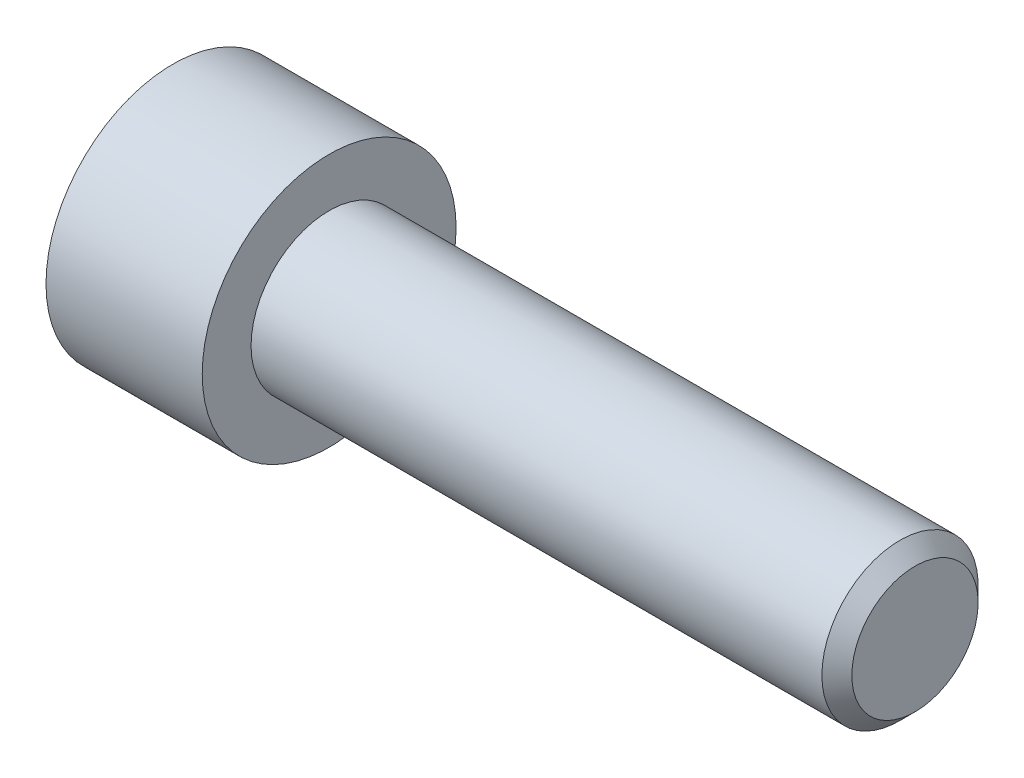
ISO-10303-21;
HEADER;
FILE_DESCRIPTION(('STEP AP214'),'2;1');
FILE_NAME('part.step','',(''),(''),'','','');
FILE_SCHEMA(('AUTOMOTIVE_DESIGN { 1 0 10303 214 1 1 1 1 }'));
ENDSEC;
DATA;
#1=APPLICATION_CONTEXT('core data for automotive mechanical design processes');
#2=APPLICATION_PROTOCOL_DEFINITION('international standard','automotive_design',2000,#1);
#3=PRODUCT_CONTEXT('',#1,'mechanical');
#4=PRODUCT('Part','Part','',(#3));
#5=PRODUCT_RELATED_PRODUCT_CATEGORY('part','',(#4));
#6=PRODUCT_DEFINITION_FORMATION('','',#4);
#7=PRODUCT_DEFINITION_CONTEXT('part definition',#1,'design');
#8=PRODUCT_DEFINITION('design','',#6,#7);
#9=PRODUCT_DEFINITION_SHAPE('','',#8);
#10=(LENGTH_UNIT() NAMED_UNIT(*) SI_UNIT(.MILLI.,.METRE.));
#11=(NAMED_UNIT(*) PLANE_ANGLE_UNIT() SI_UNIT($,.RADIAN.));
#12=(NAMED_UNIT(*) SI_UNIT($,.STERADIAN.) SOLID_ANGLE_UNIT());
#13=UNCERTAINTY_MEASURE_WITH_UNIT(LENGTH_MEASURE(1.E-05),#10,'distance_accuracy_value','');
#14=(GEOMETRIC_REPRESENTATION_CONTEXT(3) GLOBAL_UNCERTAINTY_ASSIGNED_CONTEXT((#13)) GLOBAL_UNIT_ASSIGNED_CONTEXT((#10,
#11,#12)) REPRESENTATION_CONTEXT('',''));
#15=CARTESIAN_POINT('',(0.,0.,0.));
#16=DIRECTION('',(0.,0.,1.));
#17=DIRECTION('',(1.,0.,0.));
#18=AXIS2_PLACEMENT_3D('',#15,#16,#17);
#19=CARTESIAN_POINT('',(-4.0000000000191,0.,0.));
#20=DIRECTION('',(-1.,0.,0.));
#21=DIRECTION('',(0.,0.,1.));
#22=AXIS2_PLACEMENT_3D('',#19,#20,#21);
#23=CONICAL_SURFACE('',#22,2.99000000001115,1.04719755118497);
#24=CARTESIAN_POINT('',(-4.0000000000191,0.,0.));
#25=DIRECTION('',(-1.,0.,0.));
#26=DIRECTION('',(0.,0.,1.));
#27=AXIS2_PLACEMENT_3D('',#24,#25,#26);
#28=CIRCLE('',#27,2.99000000001115);
#29=CARTESIAN_POINT('',(-4.0000000000191,0.,2.99000000001115));
#30=VERTEX_POINT('',#29);
#31=EDGE_CURVE('E19',#30,#30,#28,.T.);
#32=ORIENTED_EDGE('',*,*,#31,.T.);
#33=EDGE_LOOP('',(#32));
#34=FACE_BOUND('',#33,.T.);
#35=CARTESIAN_POINT('',(-2.27372269515058,-5.6843418860808E-11,0.));
#36=VERTEX_POINT('',#35);
#37=VERTEX_LOOP('',#36);
#38=FACE_BOUND('',#37,.T.);
#39=ADVANCED_FACE('F16',(#34,#38),#23,.F.);
#40=CARTESIAN_POINT('',(-4.,0.,0.));
#41=DIRECTION('',(1.,0.,0.));
#42=DIRECTION('',(0.,0.,-1.));
#43=AXIS2_PLACEMENT_3D('',#40,#41,#42);
#44=PLANE('',#43);
#45=ORIENTED_EDGE('',*,*,#31,.F.);
#46=EDGE_LOOP('',(#45));
#47=FACE_BOUND('',#46,.T.);
#48=DIRECTION('',(0.,0.5,0.866025403784439));
#49=VECTOR('',#48,1.);
#50=CARTESIAN_POINT('',(-4.,3.46410161513775,0.));
#51=LINE('',#50,#49);
#52=CARTESIAN_POINT('',(-4.,3.46410161513775,0.));
#53=VERTEX_POINT('',#52);
#54=CARTESIAN_POINT('',(-4.,1.73205080756888,-3.));
#55=VERTEX_POINT('',#54);
#56=EDGE_CURVE('E153',#53,#55,#51,.F.);
#57=ORIENTED_EDGE('',*,*,#56,.T.);
#58=DIRECTION('',(0.,1.,0.));
#59=VECTOR('',#58,1.);
#60=CARTESIAN_POINT('',(-4.,1.73205080756888,-3.));
#61=LINE('',#60,#59);
#62=CARTESIAN_POINT('',(-4.,-1.73205080756888,-3.));
#63=VERTEX_POINT('',#62);
#64=EDGE_CURVE('E162',#55,#63,#61,.F.);
#65=ORIENTED_EDGE('',*,*,#64,.T.);
#66=DIRECTION('',(0.,0.5,-0.866025403784439));
#67=VECTOR('',#66,1.);
#68=CARTESIAN_POINT('',(-4.,-1.73205080756888,-3.));
#69=LINE('',#68,#67);
#70=CARTESIAN_POINT('',(-4.,-3.46410161513775,0.));
#71=VERTEX_POINT('',#70);
#72=EDGE_CURVE('E167',#63,#71,#69,.F.);
#73=ORIENTED_EDGE('',*,*,#72,.T.);
#74=DIRECTION('',(0.,-0.5,-0.866025403784439));
#75=VECTOR('',#74,1.);
#76=CARTESIAN_POINT('',(-4.,-3.46410161513775,0.));
#77=LINE('',#76,#75);
#78=CARTESIAN_POINT('',(-4.,-1.73205080756888,3.));
#79=VERTEX_POINT('',#78);
#80=EDGE_CURVE('E172',#71,#79,#77,.F.);
#81=ORIENTED_EDGE('',*,*,#80,.T.);
#82=DIRECTION('',(0.,1.,0.));
#83=VECTOR('',#82,1.);
#84=CARTESIAN_POINT('',(-4.,-1.73205080756888,3.));
#85=LINE('',#84,#83);
#86=CARTESIAN_POINT('',(-4.,1.73205080756888,3.));
#87=VERTEX_POINT('',#86);
#88=EDGE_CURVE('E139',#79,#87,#85,.T.);
#89=ORIENTED_EDGE('',*,*,#88,.T.);
#90=DIRECTION('',(0.,-0.5,0.866025403784439));
#91=VECTOR('',#90,1.);
#92=CARTESIAN_POINT('',(-4.,1.73205080756888,3.));
#93=LINE('',#92,#91);
#94=EDGE_CURVE('E68',#87,#53,#93,.F.);
#95=ORIENTED_EDGE('',*,*,#94,.T.);
#96=EDGE_LOOP('',(#57,#65,#73,#81,#89,#95));
#97=FACE_BOUND('',#96,.T.);
#98=ADVANCED_FACE('F73',(#47,#97),#44,.F.);
#99=CARTESIAN_POINT('',(-8.,1.73205080756888,3.));
#100=DIRECTION('',(0.,0.866025403784439,0.5));
#101=DIRECTION('',(0.,-0.5,0.866025403784439));
#102=AXIS2_PLACEMENT_3D('',#99,#100,#101);
#103=PLANE('',#102);
#104=DIRECTION('',(1.,0.,0.));
#105=VECTOR('',#104,1.);
#106=CARTESIAN_POINT('',(-8.,1.73205080756888,3.));
#107=LINE('',#106,#105);
#108=CARTESIAN_POINT('',(-8.,1.73205080756888,3.));
#109=VERTEX_POINT('',#108);
#110=EDGE_CURVE('E134',#87,#109,#107,.F.);
#111=ORIENTED_EDGE('',*,*,#110,.T.);
#112=DIRECTION('',(0.,-0.499999999999998,0.86602540378444));
#113=VECTOR('',#112,1.);
#114=CARTESIAN_POINT('',(-8.,3.46410161513775,0.));
#115=LINE('',#114,#113);
#116=CARTESIAN_POINT('',(-8.,3.46410161513775,0.));
#117=VERTEX_POINT('',#116);
#118=EDGE_CURVE('E137',#117,#109,#115,.T.);
#119=ORIENTED_EDGE('',*,*,#118,.F.);
#120=DIRECTION('',(1.,0.,0.));
#121=VECTOR('',#120,1.);
#122=CARTESIAN_POINT('',(-8.,3.46410161513775,0.));
#123=LINE('',#122,#121);
#124=EDGE_CURVE('E156',#117,#53,#123,.T.);
#125=ORIENTED_EDGE('',*,*,#124,.T.);
#126=ORIENTED_EDGE('',*,*,#94,.F.);
#127=EDGE_LOOP('',(#111,#119,#125,#126));
#128=FACE_BOUND('',#127,.T.);
#129=ADVANCED_FACE('F79',(#128),#103,.F.);
#130=CARTESIAN_POINT('',(-8.,-1.73205080756888,3.));
#131=DIRECTION('',(0.,0.,1.));
#132=DIRECTION('',(1.,0.,0.));
#133=AXIS2_PLACEMENT_3D('',#130,#131,#132);
#134=PLANE('',#133);
#135=DIRECTION('',(1.,0.,0.));
#136=VECTOR('',#135,1.);
#137=CARTESIAN_POINT('',(-8.,-1.73205080756887,3.));
#138=LINE('',#137,#136);
#139=CARTESIAN_POINT('',(-8.,-1.73205080756888,3.));
#140=VERTEX_POINT('',#139);
#141=EDGE_CURVE('E144',#79,#140,#138,.F.);
#142=ORIENTED_EDGE('',*,*,#141,.T.);
#143=DIRECTION('',(0.,1.,0.));
#144=VECTOR('',#143,1.);
#145=CARTESIAN_POINT('',(-8.,3.25,3.));
#146=LINE('',#145,#144);
#147=EDGE_CURVE('E142',#109,#140,#146,.F.);
#148=ORIENTED_EDGE('',*,*,#147,.F.);
#149=ORIENTED_EDGE('',*,*,#110,.F.);
#150=ORIENTED_EDGE('',*,*,#88,.F.);
#151=EDGE_LOOP('',(#142,#148,#149,#150));
#152=FACE_BOUND('',#151,.T.);
#153=ADVANCED_FACE('F125',(#152),#134,.F.);
#154=CARTESIAN_POINT('',(-8.,-3.46410161513775,0.));
#155=DIRECTION('',(0.,-0.866025403784439,0.5));
#156=DIRECTION('',(0.,-0.5,-0.866025403784439));
#157=AXIS2_PLACEMENT_3D('',#154,#155,#156);
#158=PLANE('',#157);
#159=DIRECTION('',(1.,0.,0.));
#160=VECTOR('',#159,1.);
#161=CARTESIAN_POINT('',(-8.,-3.46410161513776,0.));
#162=LINE('',#161,#160);
#163=CARTESIAN_POINT('',(-8.,-3.46410161513775,0.));
#164=VERTEX_POINT('',#163);
#165=EDGE_CURVE('E170',#71,#164,#162,.F.);
#166=ORIENTED_EDGE('',*,*,#165,.T.);
#167=DIRECTION('',(0.,-0.499999999999998,-0.86602540378444));
#168=VECTOR('',#167,1.);
#169=CARTESIAN_POINT('',(-8.,-1.73205080756888,3.));
#170=LINE('',#169,#168);
#171=EDGE_CURVE('E147',#140,#164,#170,.T.);
#172=ORIENTED_EDGE('',*,*,#171,.F.);
#173=ORIENTED_EDGE('',*,*,#141,.F.);
#174=ORIENTED_EDGE('',*,*,#80,.F.);
#175=EDGE_LOOP('',(#166,#172,#173,#174));
#176=FACE_BOUND('',#175,.T.);
#177=ADVANCED_FACE('F121',(#176),#158,.F.);
#178=CARTESIAN_POINT('',(-8.,-1.73205080756888,-3.));
#179=DIRECTION('',(0.,-0.866025403784439,-0.5));
#180=DIRECTION('',(0.,0.5,-0.866025403784439));
#181=AXIS2_PLACEMENT_3D('',#178,#179,#180);
#182=PLANE('',#181);
#183=DIRECTION('',(-1.,0.,0.));
#184=VECTOR('',#183,1.);
#185=CARTESIAN_POINT('',(-8.,-1.73205080756888,-3.));
#186=LINE('',#185,#184);
#187=CARTESIAN_POINT('',(-8.,-1.73205080756888,-3.));
#188=VERTEX_POINT('',#187);
#189=EDGE_CURVE('E165',#63,#188,#186,.T.);
#190=ORIENTED_EDGE('',*,*,#189,.T.);
#191=DIRECTION('',(0.,0.499999999999998,-0.86602540378444));
#192=VECTOR('',#191,1.);
#193=CARTESIAN_POINT('',(-8.,-3.46410161513775,0.));
#194=LINE('',#193,#192);
#195=EDGE_CURVE('E190',#164,#188,#194,.T.);
#196=ORIENTED_EDGE('',*,*,#195,.F.);
#197=ORIENTED_EDGE('',*,*,#165,.F.);
#198=ORIENTED_EDGE('',*,*,#72,.F.);
#199=EDGE_LOOP('',(#190,#196,#197,#198));
#200=FACE_BOUND('',#199,.T.);
#201=ADVANCED_FACE('F118',(#200),#182,.F.);
#202=CARTESIAN_POINT('',(-8.,1.73205080756888,-3.));
#203=DIRECTION('',(0.,0.,-1.));
#204=DIRECTION('',(-1.,0.,0.));
#205=AXIS2_PLACEMENT_3D('',#202,#203,#204);
#206=PLANE('',#205);
#207=DIRECTION('',(1.,0.,0.));
#208=VECTOR('',#207,1.);
#209=CARTESIAN_POINT('',(-8.,1.73205080756887,-3.));
#210=LINE('',#209,#208);
#211=CARTESIAN_POINT('',(-8.,1.73205080756888,-3.));
#212=VERTEX_POINT('',#211);
#213=EDGE_CURVE('E34',#55,#212,#210,.F.);
#214=ORIENTED_EDGE('',*,*,#213,.T.);
#215=DIRECTION('',(0.,1.,0.));
#216=VECTOR('',#215,1.);
#217=CARTESIAN_POINT('',(-8.,3.25,-3.));
#218=LINE('',#217,#216);
#219=EDGE_CURVE('E188',#188,#212,#218,.T.);
#220=ORIENTED_EDGE('',*,*,#219,.F.);
#221=ORIENTED_EDGE('',*,*,#189,.F.);
#222=ORIENTED_EDGE('',*,*,#64,.F.);
#223=EDGE_LOOP('',(#214,#220,#221,#222));
#224=FACE_BOUND('',#223,.T.);
#225=ADVANCED_FACE('F114',(#224),#206,.F.);
#226=CARTESIAN_POINT('',(-8.,3.46410161513775,0.));
#227=DIRECTION('',(0.,0.866025403784439,-0.5));
#228=DIRECTION('',(0.,0.5,0.866025403784439));
#229=AXIS2_PLACEMENT_3D('',#226,#227,#228);
#230=PLANE('',#229);
#231=ORIENTED_EDGE('',*,*,#124,.F.);
#232=DIRECTION('',(0.,0.499999999999998,0.86602540378444));
#233=VECTOR('',#232,1.);
#234=CARTESIAN_POINT('',(-8.,1.73205080756888,-3.));
#235=LINE('',#234,#233);
#236=EDGE_CURVE('E152',#212,#117,#235,.T.);
#237=ORIENTED_EDGE('',*,*,#236,.F.);
#238=ORIENTED_EDGE('',*,*,#213,.F.);
#239=ORIENTED_EDGE('',*,*,#56,.F.);
#240=EDGE_LOOP('',(#231,#237,#238,#239));
#241=FACE_BOUND('',#240,.T.);
#242=ADVANCED_FACE('F110',(#241),#230,.F.);
#243=CARTESIAN_POINT('',(-8.,3.25,0.));
#244=DIRECTION('',(-1.,0.,0.));
#245=DIRECTION('',(0.,0.,1.));
#246=AXIS2_PLACEMENT_3D('',#243,#244,#245);
#247=PLANE('',#246);
#248=ORIENTED_EDGE('',*,*,#219,.T.);
#249=ORIENTED_EDGE('',*,*,#236,.T.);
#250=ORIENTED_EDGE('',*,*,#118,.T.);
#251=ORIENTED_EDGE('',*,*,#147,.T.);
#252=ORIENTED_EDGE('',*,*,#171,.T.);
#253=ORIENTED_EDGE('',*,*,#195,.T.);
#254=EDGE_LOOP('',(#248,#249,#250,#251,#252,#253));
#255=FACE_BOUND('',#254,.T.);
#256=CARTESIAN_POINT('',(-8.,0.,0.));
#257=DIRECTION('',(-1.,0.,0.));
#258=DIRECTION('',(0.,0.,1.));
#259=AXIS2_PLACEMENT_3D('',#256,#257,#258);
#260=CIRCLE('',#259,6.5);
#261=CARTESIAN_POINT('',(-8.,0.,6.5));
#262=VERTEX_POINT('',#261);
#263=EDGE_CURVE('E184',#262,#262,#260,.F.);
#264=ORIENTED_EDGE('',*,*,#263,.F.);
#265=EDGE_LOOP('',(#264));
#266=FACE_BOUND('',#265,.T.);
#267=ADVANCED_FACE('F106',(#255,#266),#247,.T.);
#268=CARTESIAN_POINT('',(-4.,0.,0.));
#269=DIRECTION('',(-1.,0.,0.));
#270=DIRECTION('',(0.,0.,1.));
#271=AXIS2_PLACEMENT_3D('',#268,#269,#270);
#272=CYLINDRICAL_SURFACE('',#271,6.5);
#273=CARTESIAN_POINT('',(0.,0.,0.));
#274=DIRECTION('',(-1.,0.,0.));
#275=DIRECTION('',(0.,0.,1.));
#276=AXIS2_PLACEMENT_3D('',#273,#274,#275);
#277=CIRCLE('',#276,6.5);
#278=CARTESIAN_POINT('',(0.,0.,6.5));
#279=VERTEX_POINT('',#278);
#280=EDGE_CURVE('E182',#279,#279,#277,.F.);
#281=ORIENTED_EDGE('',*,*,#280,.F.);
#282=EDGE_LOOP('',(#281));
#283=FACE_BOUND('',#282,.T.);
#284=ORIENTED_EDGE('',*,*,#263,.T.);
#285=EDGE_LOOP('',(#284));
#286=FACE_BOUND('',#285,.T.);
#287=ADVANCED_FACE('F102',(#283,#286),#272,.T.);
#288=CARTESIAN_POINT('',(30.,1.6165,0.));
#289=DIRECTION('',(1.,0.,0.));
#290=DIRECTION('',(0.,0.,-1.));
#291=AXIS2_PLACEMENT_3D('',#288,#289,#290);
#292=PLANE('',#291);
#293=CARTESIAN_POINT('',(30.0000000000296,0.,0.));
#294=DIRECTION('',(-1.,0.,0.));
#295=DIRECTION('',(0.,0.,1.));
#296=AXIS2_PLACEMENT_3D('',#293,#294,#295);
#297=CIRCLE('',#296,3.23299999996607);
#298=CARTESIAN_POINT('',(30.0000000000296,0.,3.23299999996607));
#299=VERTEX_POINT('',#298);
#300=EDGE_CURVE('E179',#299,#299,#297,.T.);
#301=ORIENTED_EDGE('',*,*,#300,.F.);
#302=EDGE_LOOP('',(#301));
#303=FACE_BOUND('',#302,.T.);
#304=ADVANCED_FACE('F98',(#303),#292,.T.);
#305=CARTESIAN_POINT('',(0.,5.25,0.));
#306=DIRECTION('',(1.,0.,0.));
#307=DIRECTION('',(0.,0.,-1.));
#308=AXIS2_PLACEMENT_3D('',#305,#306,#307);
#309=PLANE('',#308);
#310=CARTESIAN_POINT('',(0.,0.,0.));
#311=DIRECTION('',(-1.,0.,0.));
#312=DIRECTION('',(0.,0.,1.));
#313=AXIS2_PLACEMENT_3D('',#310,#311,#312);
#314=CIRCLE('',#313,4.);
#315=CARTESIAN_POINT('',(0.,0.,4.));
#316=VERTEX_POINT('',#315);
#317=EDGE_CURVE('E25',#316,#316,#314,.F.);
#318=ORIENTED_EDGE('',*,*,#317,.F.);
#319=EDGE_LOOP('',(#318));
#320=FACE_BOUND('',#319,.T.);
#321=ORIENTED_EDGE('',*,*,#280,.T.);
#322=EDGE_LOOP('',(#321));
#323=FACE_BOUND('',#322,.T.);
#324=ADVANCED_FACE('F90',(#320,#323),#309,.T.);
#325=CARTESIAN_POINT('',(29.2329999999765,0.,0.));
#326=DIRECTION('',(-1.,0.,0.));
#327=DIRECTION('',(0.,0.,1.));
#328=AXIS2_PLACEMENT_3D('',#325,#326,#327);
#329=CONICAL_SURFACE('',#328,3.99999999996226,0.785398163360393);
#330=ORIENTED_EDGE('',*,*,#300,.T.);
#331=EDGE_LOOP('',(#330));
#332=FACE_BOUND('',#331,.T.);
#333=CARTESIAN_POINT('',(29.233,0.,0.));
#334=DIRECTION('',(-1.,0.,0.));
#335=DIRECTION('',(0.,0.,1.));
#336=AXIS2_PLACEMENT_3D('',#333,#334,#335);
#337=CIRCLE('',#336,4.);
#338=CARTESIAN_POINT('',(29.233,0.,4.));
#339=VERTEX_POINT('',#338);
#340=EDGE_CURVE('E11',#339,#339,#337,.T.);
#341=ORIENTED_EDGE('',*,*,#340,.F.);
#342=EDGE_LOOP('',(#341));
#343=FACE_BOUND('',#342,.T.);
#344=ADVANCED_FACE('F84',(#332,#343),#329,.T.);
#345=CARTESIAN_POINT('',(14.6165,0.,0.));
#346=DIRECTION('',(-1.,0.,0.));
#347=DIRECTION('',(0.,0.,1.));
#348=AXIS2_PLACEMENT_3D('',#345,#346,#347);
#349=CYLINDRICAL_SURFACE('',#348,4.);
#350=ORIENTED_EDGE('',*,*,#317,.T.);
#351=EDGE_LOOP('',(#350));
#352=FACE_BOUND('',#351,.T.);
#353=ORIENTED_EDGE('',*,*,#340,.T.);
#354=EDGE_LOOP('',(#353));
#355=FACE_BOUND('',#354,.T.);
#356=ADVANCED_FACE('F82',(#352,#355),#349,.T.);
#357=CLOSED_SHELL('',(#39,#98,#129,#153,#177,#201,#225,#242,#267,#287,#304,#324,#344,#356));
#358=MANIFOLD_SOLID_BREP('B1',#357);
#359=ADVANCED_BREP_SHAPE_REPRESENTATION('',(#18,#358),#14);
#360=SHAPE_DEFINITION_REPRESENTATION(#9,#359);
ENDSEC;
END-ISO-10303-21;
